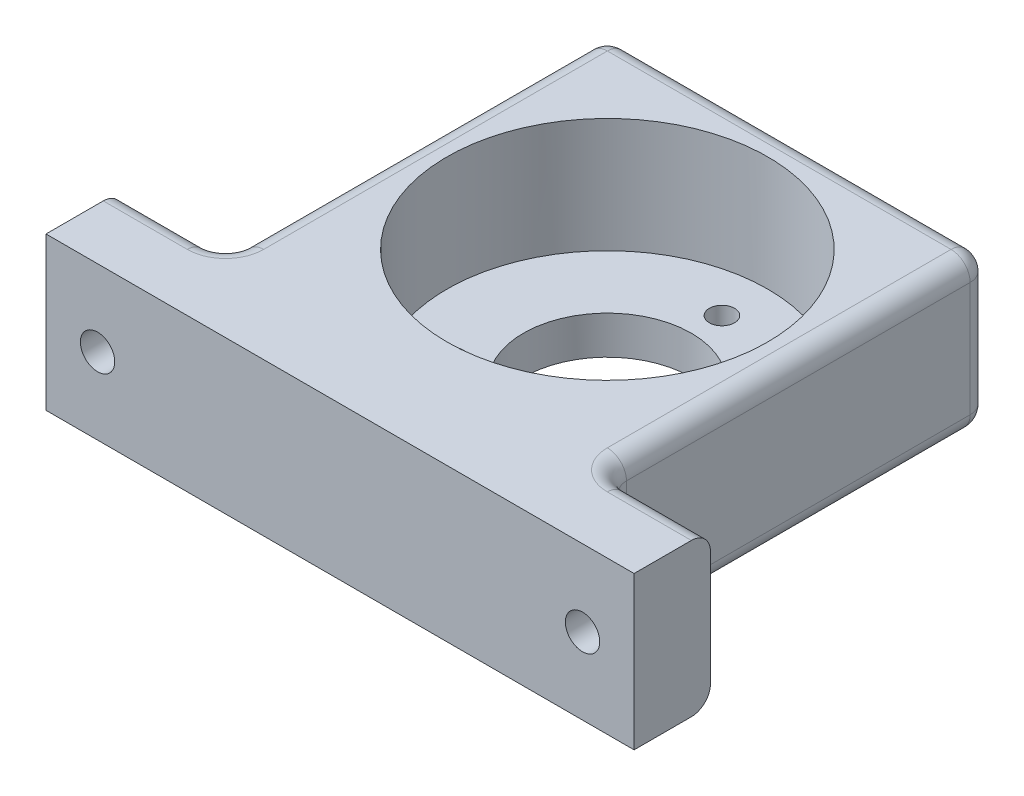
ISO-10303-21;
HEADER;
FILE_DESCRIPTION(('STEP AP214'),'2;1');
FILE_NAME('part.step','',(''),(''),'','','');
FILE_SCHEMA(('AUTOMOTIVE_DESIGN { 1 0 10303 214 1 1 1 1 }'));
ENDSEC;
DATA;
#1=APPLICATION_CONTEXT('core data for automotive mechanical design processes');
#2=APPLICATION_PROTOCOL_DEFINITION('international standard','automotive_design',2000,#1);
#3=PRODUCT_CONTEXT('',#1,'mechanical');
#4=PRODUCT('Part','Part','',(#3));
#5=PRODUCT_RELATED_PRODUCT_CATEGORY('part','',(#4));
#6=PRODUCT_DEFINITION_FORMATION('','',#4);
#7=PRODUCT_DEFINITION_CONTEXT('part definition',#1,'design');
#8=PRODUCT_DEFINITION('design','',#6,#7);
#9=PRODUCT_DEFINITION_SHAPE('','',#8);
#10=(LENGTH_UNIT() NAMED_UNIT(*) SI_UNIT(.MILLI.,.METRE.));
#11=(NAMED_UNIT(*) PLANE_ANGLE_UNIT() SI_UNIT($,.RADIAN.));
#12=(NAMED_UNIT(*) SI_UNIT($,.STERADIAN.) SOLID_ANGLE_UNIT());
#13=UNCERTAINTY_MEASURE_WITH_UNIT(LENGTH_MEASURE(1.E-05),#10,'distance_accuracy_value','');
#14=(GEOMETRIC_REPRESENTATION_CONTEXT(3) GLOBAL_UNCERTAINTY_ASSIGNED_CONTEXT((#13)) GLOBAL_UNIT_ASSIGNED_CONTEXT((#10,
#11,#12)) REPRESENTATION_CONTEXT('',''));
#15=CARTESIAN_POINT('',(0.,0.,0.));
#16=DIRECTION('',(0.,0.,1.));
#17=DIRECTION('',(1.,0.,0.));
#18=AXIS2_PLACEMENT_3D('',#15,#16,#17);
#19=CARTESIAN_POINT('',(38.5,20.,25.));
#20=DIRECTION('',(0.,0.,1.));
#21=DIRECTION('',(1.,0.,0.));
#22=AXIS2_PLACEMENT_3D('',#19,#20,#21);
#23=PLANE('',#22);
#24=DIRECTION('',(0.,-1.,0.));
#25=VECTOR('',#24,1.);
#26=CARTESIAN_POINT('',(27.5,20.,25.));
#27=LINE('',#26,#25);
#28=CARTESIAN_POINT('',(27.5,2.5,25.));
#29=VERTEX_POINT('',#28);
#30=CARTESIAN_POINT('',(27.5,17.5,25.));
#31=VERTEX_POINT('',#30);
#32=EDGE_CURVE('E240',#29,#31,#27,.F.);
#33=ORIENTED_EDGE('',*,*,#32,.T.);
#34=DIRECTION('',(-1.,0.,0.));
#35=VECTOR('',#34,1.);
#36=CARTESIAN_POINT('',(38.5,17.5,25.));
#37=LINE('',#36,#35);
#38=CARTESIAN_POINT('',(38.5,17.5,25.));
#39=VERTEX_POINT('',#38);
#40=EDGE_CURVE('E244',#31,#39,#37,.F.);
#41=ORIENTED_EDGE('',*,*,#40,.T.);
#42=DIRECTION('',(0.,-1.,0.));
#43=VECTOR('',#42,1.);
#44=CARTESIAN_POINT('',(38.5,20.,25.));
#45=LINE('',#44,#43);
#46=CARTESIAN_POINT('',(38.5,2.5,25.));
#47=VERTEX_POINT('',#46);
#48=EDGE_CURVE('E205',#39,#47,#45,.T.);
#49=ORIENTED_EDGE('',*,*,#48,.T.);
#50=DIRECTION('',(-1.,0.,0.));
#51=VECTOR('',#50,1.);
#52=CARTESIAN_POINT('',(25.,2.5,25.));
#53=LINE('',#52,#51);
#54=EDGE_CURVE('E242',#47,#29,#53,.T.);
#55=ORIENTED_EDGE('',*,*,#54,.T.);
#56=EDGE_LOOP('',(#33,#41,#49,#55));
#57=FACE_BOUND('',#56,.T.);
#58=CARTESIAN_POINT('',(31.75,10.,25.));
#59=DIRECTION('',(0.,0.,-1.));
#60=DIRECTION('',(-1.,0.,0.));
#61=AXIS2_PLACEMENT_3D('',#58,#59,#60);
#62=CIRCLE('',#61,4.);
#63=CARTESIAN_POINT('',(27.75,10.,25.));
#64=VERTEX_POINT('',#63);
#65=EDGE_CURVE('E381',#64,#64,#62,.T.);
#66=ORIENTED_EDGE('',*,*,#65,.F.);
#67=EDGE_LOOP('',(#66));
#68=FACE_BOUND('',#67,.T.);
#69=ADVANCED_FACE('F37',(#57,#68),#23,.F.);
#70=CARTESIAN_POINT('',(-25.,20.,25.));
#71=DIRECTION('',(0.,0.,1.));
#72=DIRECTION('',(1.,0.,0.));
#73=AXIS2_PLACEMENT_3D('',#70,#71,#72);
#74=PLANE('',#73);
#75=DIRECTION('',(0.,-1.,0.));
#76=VECTOR('',#75,1.);
#77=CARTESIAN_POINT('',(-38.5,20.,25.));
#78=LINE('',#77,#76);
#79=CARTESIAN_POINT('',(-38.5,17.5,25.));
#80=VERTEX_POINT('',#79);
#81=CARTESIAN_POINT('',(-38.5,2.5,25.));
#82=VERTEX_POINT('',#81);
#83=EDGE_CURVE('E197',#80,#82,#78,.T.);
#84=ORIENTED_EDGE('',*,*,#83,.F.);
#85=DIRECTION('',(-1.,0.,0.));
#86=VECTOR('',#85,1.);
#87=CARTESIAN_POINT('',(-25.,17.5,25.));
#88=LINE('',#87,#86);
#89=CARTESIAN_POINT('',(-27.5,17.5,25.));
#90=VERTEX_POINT('',#89);
#91=EDGE_CURVE('E274',#80,#90,#88,.F.);
#92=ORIENTED_EDGE('',*,*,#91,.T.);
#93=DIRECTION('',(0.,-1.,0.));
#94=VECTOR('',#93,1.);
#95=CARTESIAN_POINT('',(-27.5,0.,25.));
#96=LINE('',#95,#94);
#97=CARTESIAN_POINT('',(-27.5,2.5,25.));
#98=VERTEX_POINT('',#97);
#99=EDGE_CURVE('E270',#90,#98,#96,.T.);
#100=ORIENTED_EDGE('',*,*,#99,.T.);
#101=DIRECTION('',(-1.,0.,0.));
#102=VECTOR('',#101,1.);
#103=CARTESIAN_POINT('',(-38.5,2.5,25.));
#104=LINE('',#103,#102);
#105=EDGE_CURVE('E272',#98,#82,#104,.T.);
#106=ORIENTED_EDGE('',*,*,#105,.T.);
#107=EDGE_LOOP('',(#84,#92,#100,#106));
#108=FACE_BOUND('',#107,.T.);
#109=CARTESIAN_POINT('',(-31.75,10.,25.));
#110=DIRECTION('',(0.,0.,-1.));
#111=DIRECTION('',(-1.,0.,0.));
#112=AXIS2_PLACEMENT_3D('',#109,#110,#111);
#113=CIRCLE('',#112,4.);
#114=CARTESIAN_POINT('',(-35.75,10.,25.));
#115=VERTEX_POINT('',#114);
#116=EDGE_CURVE('E394',#115,#115,#113,.T.);
#117=ORIENTED_EDGE('',*,*,#116,.F.);
#118=EDGE_LOOP('',(#117));
#119=FACE_BOUND('',#118,.T.);
#120=ADVANCED_FACE('F434',(#108,#119),#74,.F.);
#121=CARTESIAN_POINT('',(0.,20.,0.));
#122=DIRECTION('',(0.,-1.,0.));
#123=DIRECTION('',(0.,0.,-1.));
#124=AXIS2_PLACEMENT_3D('',#121,#122,#123);
#125=PLANE('',#124);
#126=DIRECTION('',(0.,0.,-1.));
#127=VECTOR('',#126,1.);
#128=CARTESIAN_POINT('',(38.5,20.,35.));
#129=LINE('',#128,#127);
#130=CARTESIAN_POINT('',(38.5,20.,35.));
#131=VERTEX_POINT('',#130);
#132=CARTESIAN_POINT('',(38.5,20.,27.5));
#133=VERTEX_POINT('',#132);
#134=EDGE_CURVE('E203',#131,#133,#129,.T.);
#135=ORIENTED_EDGE('',*,*,#134,.T.);
#136=DIRECTION('',(-1.,0.,0.));
#137=VECTOR('',#136,1.);
#138=CARTESIAN_POINT('',(0.,20.,27.5));
#139=LINE('',#138,#137);
#140=CARTESIAN_POINT('',(27.5,20.,27.5));
#141=VERTEX_POINT('',#140);
#142=EDGE_CURVE('E237',#133,#141,#139,.T.);
#143=ORIENTED_EDGE('',*,*,#142,.T.);
#144=CARTESIAN_POINT('',(27.5,20.,22.5));
#145=DIRECTION('',(0.,-1.,0.));
#146=DIRECTION('',(0.,0.,-1.));
#147=AXIS2_PLACEMENT_3D('',#144,#145,#146);
#148=CIRCLE('',#147,5.);
#149=CARTESIAN_POINT('',(22.5,20.,22.5));
#150=VERTEX_POINT('',#149);
#151=EDGE_CURVE('E234',#150,#141,#148,.F.);
#152=ORIENTED_EDGE('',*,*,#151,.F.);
#153=DIRECTION('',(0.,0.,-1.));
#154=VECTOR('',#153,1.);
#155=CARTESIAN_POINT('',(22.5,20.,0.));
#156=LINE('',#155,#154);
#157=CARTESIAN_POINT('',(22.5,20.,-22.5));
#158=VERTEX_POINT('',#157);
#159=EDGE_CURVE('E232',#150,#158,#156,.T.);
#160=ORIENTED_EDGE('',*,*,#159,.T.);
#161=DIRECTION('',(-1.,0.,0.));
#162=VECTOR('',#161,1.);
#163=CARTESIAN_POINT('',(0.,20.,-22.5));
#164=LINE('',#163,#162);
#165=CARTESIAN_POINT('',(-22.5,20.,-22.5));
#166=VERTEX_POINT('',#165);
#167=EDGE_CURVE('E229',#158,#166,#164,.T.);
#168=ORIENTED_EDGE('',*,*,#167,.T.);
#169=DIRECTION('',(0.,0.,1.));
#170=VECTOR('',#169,1.);
#171=CARTESIAN_POINT('',(-22.5,20.,0.));
#172=LINE('',#171,#170);
#173=CARTESIAN_POINT('',(-22.5,20.,22.5));
#174=VERTEX_POINT('',#173);
#175=EDGE_CURVE('E227',#166,#174,#172,.T.);
#176=ORIENTED_EDGE('',*,*,#175,.T.);
#177=CARTESIAN_POINT('',(-27.5,20.,22.5));
#178=DIRECTION('',(0.,-1.,0.));
#179=DIRECTION('',(0.,0.,-1.));
#180=AXIS2_PLACEMENT_3D('',#177,#178,#179);
#181=CIRCLE('',#180,5.);
#182=CARTESIAN_POINT('',(-27.5,20.,27.5));
#183=VERTEX_POINT('',#182);
#184=EDGE_CURVE('E220',#183,#174,#181,.F.);
#185=ORIENTED_EDGE('',*,*,#184,.F.);
#186=DIRECTION('',(-1.,0.,0.));
#187=VECTOR('',#186,1.);
#188=CARTESIAN_POINT('',(0.,20.,27.5));
#189=LINE('',#188,#187);
#190=CARTESIAN_POINT('',(-38.5,20.,27.5));
#191=VERTEX_POINT('',#190);
#192=EDGE_CURVE('E185',#183,#191,#189,.T.);
#193=ORIENTED_EDGE('',*,*,#192,.T.);
#194=DIRECTION('',(0.,0.,1.));
#195=VECTOR('',#194,1.);
#196=CARTESIAN_POINT('',(-38.5,20.,25.));
#197=LINE('',#196,#195);
#198=CARTESIAN_POINT('',(-38.5,20.,35.));
#199=VERTEX_POINT('',#198);
#200=EDGE_CURVE('E176',#191,#199,#197,.T.);
#201=ORIENTED_EDGE('',*,*,#200,.T.);
#202=DIRECTION('',(1.,0.,0.));
#203=VECTOR('',#202,1.);
#204=CARTESIAN_POINT('',(-38.5,20.,35.));
#205=LINE('',#204,#203);
#206=EDGE_CURVE('E182',#199,#131,#205,.T.);
#207=ORIENTED_EDGE('',*,*,#206,.T.);
#208=EDGE_LOOP('',(#135,#143,#152,#160,#168,#176,#185,#193,#201,#207));
#209=FACE_BOUND('',#208,.T.);
#210=CARTESIAN_POINT('',(0.,20.,0.));
#211=DIRECTION('',(0.,1.,0.));
#212=DIRECTION('',(0.,0.,1.));
#213=AXIS2_PLACEMENT_3D('',#210,#211,#212);
#214=CIRCLE('',#213,21.);
#215=CARTESIAN_POINT('',(0.,20.,21.));
#216=VERTEX_POINT('',#215);
#217=EDGE_CURVE('E406',#216,#216,#214,.T.);
#218=ORIENTED_EDGE('',*,*,#217,.F.);
#219=EDGE_LOOP('',(#218));
#220=FACE_BOUND('',#219,.T.);
#221=ADVANCED_FACE('F179',(#209,#220),#125,.F.);
#222=CARTESIAN_POINT('',(0.,0.,0.));
#223=DIRECTION('',(0.,-1.,0.));
#224=DIRECTION('',(0.,0.,-1.));
#225=AXIS2_PLACEMENT_3D('',#222,#223,#224);
#226=PLANE('',#225);
#227=CARTESIAN_POINT('',(12.9903810567666,0.,7.49999999999988));
#228=DIRECTION('',(0.,-1.,0.));
#229=DIRECTION('',(0.,0.,-1.));
#230=AXIS2_PLACEMENT_3D('',#227,#228,#229);
#231=CIRCLE('',#230,1.65);
#232=CARTESIAN_POINT('',(12.9903810567666,0.,5.84999999999988));
#233=VERTEX_POINT('',#232);
#234=EDGE_CURVE('E635',#233,#233,#231,.T.);
#235=ORIENTED_EDGE('',*,*,#234,.F.);
#236=EDGE_LOOP('',(#235));
#237=FACE_BOUND('',#236,.T.);
#238=CARTESIAN_POINT('',(-12.9903810567665,0.,7.50000000000006));
#239=DIRECTION('',(0.,-1.,0.));
#240=DIRECTION('',(0.,0.,-1.));
#241=AXIS2_PLACEMENT_3D('',#238,#239,#240);
#242=CIRCLE('',#241,1.65);
#243=CARTESIAN_POINT('',(-12.9903810567665,0.,5.85000000000006));
#244=VERTEX_POINT('',#243);
#245=EDGE_CURVE('E375',#244,#244,#242,.T.);
#246=ORIENTED_EDGE('',*,*,#245,.F.);
#247=EDGE_LOOP('',(#246));
#248=FACE_BOUND('',#247,.T.);
#249=CARTESIAN_POINT('',(0.,0.,-15.));
#250=DIRECTION('',(0.,-1.,0.));
#251=DIRECTION('',(0.,0.,-1.));
#252=AXIS2_PLACEMENT_3D('',#249,#250,#251);
#253=CIRCLE('',#252,1.65);
#254=CARTESIAN_POINT('',(0.,0.,-16.65));
#255=VERTEX_POINT('',#254);
#256=EDGE_CURVE('E366',#255,#255,#253,.T.);
#257=ORIENTED_EDGE('',*,*,#256,.F.);
#258=EDGE_LOOP('',(#257));
#259=FACE_BOUND('',#258,.T.);
#260=CARTESIAN_POINT('',(27.5,0.,22.5));
#261=DIRECTION('',(0.,-1.,0.));
#262=DIRECTION('',(0.,0.,-1.));
#263=AXIS2_PLACEMENT_3D('',#260,#261,#262);
#264=CIRCLE('',#263,5.);
#265=CARTESIAN_POINT('',(27.5,0.,27.5));
#266=VERTEX_POINT('',#265);
#267=CARTESIAN_POINT('',(22.5,0.,22.5));
#268=VERTEX_POINT('',#267);
#269=EDGE_CURVE('E261',#266,#268,#264,.T.);
#270=ORIENTED_EDGE('',*,*,#269,.F.);
#271=DIRECTION('',(-1.,0.,0.));
#272=VECTOR('',#271,1.);
#273=CARTESIAN_POINT('',(38.5,0.,27.5));
#274=LINE('',#273,#272);
#275=CARTESIAN_POINT('',(38.5,0.,27.5));
#276=VERTEX_POINT('',#275);
#277=EDGE_CURVE('E264',#266,#276,#274,.F.);
#278=ORIENTED_EDGE('',*,*,#277,.T.);
#279=DIRECTION('',(0.,0.,-1.));
#280=VECTOR('',#279,1.);
#281=CARTESIAN_POINT('',(38.5,0.,35.));
#282=LINE('',#281,#280);
#283=CARTESIAN_POINT('',(38.5,0.,35.));
#284=VERTEX_POINT('',#283);
#285=EDGE_CURVE('E188',#284,#276,#282,.T.);
#286=ORIENTED_EDGE('',*,*,#285,.F.);
#287=DIRECTION('',(1.,0.,0.));
#288=VECTOR('',#287,1.);
#289=CARTESIAN_POINT('',(-38.5,0.,35.));
#290=LINE('',#289,#288);
#291=CARTESIAN_POINT('',(-38.5,0.,35.));
#292=VERTEX_POINT('',#291);
#293=EDGE_CURVE('E210',#292,#284,#290,.T.);
#294=ORIENTED_EDGE('',*,*,#293,.F.);
#295=DIRECTION('',(0.,0.,1.));
#296=VECTOR('',#295,1.);
#297=CARTESIAN_POINT('',(-38.5,0.,25.));
#298=LINE('',#297,#296);
#299=CARTESIAN_POINT('',(-38.5,0.,27.5));
#300=VERTEX_POINT('',#299);
#301=EDGE_CURVE('E194',#300,#292,#298,.T.);
#302=ORIENTED_EDGE('',*,*,#301,.F.);
#303=DIRECTION('',(-1.,0.,0.));
#304=VECTOR('',#303,1.);
#305=CARTESIAN_POINT('',(-25.,0.,27.5));
#306=LINE('',#305,#304);
#307=CARTESIAN_POINT('',(-27.5,0.,27.5));
#308=VERTEX_POINT('',#307);
#309=EDGE_CURVE('E257',#300,#308,#306,.F.);
#310=ORIENTED_EDGE('',*,*,#309,.T.);
#311=CARTESIAN_POINT('',(-27.5,0.,22.5));
#312=DIRECTION('',(0.,-1.,0.));
#313=DIRECTION('',(0.,0.,-1.));
#314=AXIS2_PLACEMENT_3D('',#311,#312,#313);
#315=CIRCLE('',#314,5.);
#316=CARTESIAN_POINT('',(-22.5,0.,22.5));
#317=VERTEX_POINT('',#316);
#318=EDGE_CURVE('E254',#317,#308,#315,.T.);
#319=ORIENTED_EDGE('',*,*,#318,.F.);
#320=DIRECTION('',(0.,0.,1.));
#321=VECTOR('',#320,1.);
#322=CARTESIAN_POINT('',(-22.5,0.,-25.));
#323=LINE('',#322,#321);
#324=CARTESIAN_POINT('',(-22.5,0.,-22.5));
#325=VERTEX_POINT('',#324);
#326=EDGE_CURVE('E250',#317,#325,#323,.F.);
#327=ORIENTED_EDGE('',*,*,#326,.T.);
#328=DIRECTION('',(-1.,0.,0.));
#329=VECTOR('',#328,1.);
#330=CARTESIAN_POINT('',(25.,0.,-22.5));
#331=LINE('',#330,#329);
#332=CARTESIAN_POINT('',(22.5,0.,-22.5));
#333=VERTEX_POINT('',#332);
#334=EDGE_CURVE('E252',#325,#333,#331,.F.);
#335=ORIENTED_EDGE('',*,*,#334,.T.);
#336=DIRECTION('',(0.,0.,-1.));
#337=VECTOR('',#336,1.);
#338=CARTESIAN_POINT('',(22.5,0.,25.));
#339=LINE('',#338,#337);
#340=EDGE_CURVE('E259',#333,#268,#339,.F.);
#341=ORIENTED_EDGE('',*,*,#340,.T.);
#342=EDGE_LOOP('',(#270,#278,#286,#294,#302,#310,#319,#327,#335,#341));
#343=FACE_BOUND('',#342,.T.);
#344=CARTESIAN_POINT('',(0.,0.,0.));
#345=DIRECTION('',(0.,1.,0.));
#346=DIRECTION('',(0.,0.,1.));
#347=AXIS2_PLACEMENT_3D('',#344,#345,#346);
#348=CIRCLE('',#347,11.);
#349=CARTESIAN_POINT('',(0.,0.,11.));
#350=VERTEX_POINT('',#349);
#351=EDGE_CURVE('E211',#350,#350,#348,.T.);
#352=ORIENTED_EDGE('',*,*,#351,.T.);
#353=EDGE_LOOP('',(#352));
#354=FACE_BOUND('',#353,.T.);
#355=ADVANCED_FACE('F413',(#237,#248,#259,#343,#354),#226,.T.);
#356=CARTESIAN_POINT('',(-25.,20.,-25.));
#357=DIRECTION('',(0.,0.,1.));
#358=DIRECTION('',(1.,0.,0.));
#359=AXIS2_PLACEMENT_3D('',#356,#357,#358);
#360=PLANE('',#359);
#361=DIRECTION('',(-1.,0.,0.));
#362=VECTOR('',#361,1.);
#363=CARTESIAN_POINT('',(-25.,17.5,-25.));
#364=LINE('',#363,#362);
#365=CARTESIAN_POINT('',(-22.5,17.5,-25.));
#366=VERTEX_POINT('',#365);
#367=CARTESIAN_POINT('',(22.5,17.5,-25.));
#368=VERTEX_POINT('',#367);
#369=EDGE_CURVE('E46',#366,#368,#364,.F.);
#370=ORIENTED_EDGE('',*,*,#369,.T.);
#371=DIRECTION('',(0.,-1.,0.));
#372=VECTOR('',#371,1.);
#373=CARTESIAN_POINT('',(22.5,20.,-25.));
#374=LINE('',#373,#372);
#375=CARTESIAN_POINT('',(22.5,2.5,-25.));
#376=VERTEX_POINT('',#375);
#377=EDGE_CURVE('E12',#368,#376,#374,.T.);
#378=ORIENTED_EDGE('',*,*,#377,.T.);
#379=DIRECTION('',(-1.,0.,0.));
#380=VECTOR('',#379,1.);
#381=CARTESIAN_POINT('',(-25.,2.5,-25.));
#382=LINE('',#381,#380);
#383=CARTESIAN_POINT('',(-22.5,2.5,-25.));
#384=VERTEX_POINT('',#383);
#385=EDGE_CURVE('E296',#376,#384,#382,.T.);
#386=ORIENTED_EDGE('',*,*,#385,.T.);
#387=DIRECTION('',(0.,-1.,0.));
#388=VECTOR('',#387,1.);
#389=CARTESIAN_POINT('',(-22.5,20.,-25.));
#390=LINE('',#389,#388);
#391=EDGE_CURVE('E294',#384,#366,#390,.F.);
#392=ORIENTED_EDGE('',*,*,#391,.T.);
#393=EDGE_LOOP('',(#370,#378,#386,#392));
#394=FACE_BOUND('',#393,.T.);
#395=ADVANCED_FACE('F456',(#394),#360,.F.);
#396=CARTESIAN_POINT('',(-25.,20.,25.));
#397=DIRECTION('',(1.,0.,0.));
#398=DIRECTION('',(0.,0.,-1.));
#399=AXIS2_PLACEMENT_3D('',#396,#397,#398);
#400=PLANE('',#399);
#401=DIRECTION('',(0.,0.,1.));
#402=VECTOR('',#401,1.);
#403=CARTESIAN_POINT('',(-25.,2.5,25.));
#404=LINE('',#403,#402);
#405=CARTESIAN_POINT('',(-25.,2.5,-22.5));
#406=VERTEX_POINT('',#405);
#407=CARTESIAN_POINT('',(-25.,2.5,22.5));
#408=VERTEX_POINT('',#407);
#409=EDGE_CURVE('E289',#406,#408,#404,.T.);
#410=ORIENTED_EDGE('',*,*,#409,.T.);
#411=DIRECTION('',(0.,-1.,0.));
#412=VECTOR('',#411,1.);
#413=CARTESIAN_POINT('',(-25.,20.,22.5));
#414=LINE('',#413,#412);
#415=CARTESIAN_POINT('',(-25.,17.5,22.5));
#416=VERTEX_POINT('',#415);
#417=EDGE_CURVE('E291',#408,#416,#414,.F.);
#418=ORIENTED_EDGE('',*,*,#417,.T.);
#419=DIRECTION('',(0.,0.,1.));
#420=VECTOR('',#419,1.);
#421=CARTESIAN_POINT('',(-25.,17.5,25.));
#422=LINE('',#421,#420);
#423=CARTESIAN_POINT('',(-25.,17.5,-22.5));
#424=VERTEX_POINT('',#423);
#425=EDGE_CURVE('E287',#416,#424,#422,.F.);
#426=ORIENTED_EDGE('',*,*,#425,.T.);
#427=DIRECTION('',(0.,-1.,0.));
#428=VECTOR('',#427,1.);
#429=CARTESIAN_POINT('',(-25.,20.,-22.5));
#430=LINE('',#429,#428);
#431=EDGE_CURVE('E285',#424,#406,#430,.T.);
#432=ORIENTED_EDGE('',*,*,#431,.T.);
#433=EDGE_LOOP('',(#410,#418,#426,#432));
#434=FACE_BOUND('',#433,.T.);
#435=ADVANCED_FACE('F452',(#434),#400,.F.);
#436=CARTESIAN_POINT('',(-38.5,20.,25.));
#437=DIRECTION('',(1.,0.,0.));
#438=DIRECTION('',(0.,0.,-1.));
#439=AXIS2_PLACEMENT_3D('',#436,#437,#438);
#440=PLANE('',#439);
#441=ORIENTED_EDGE('',*,*,#200,.F.);
#442=CARTESIAN_POINT('',(-38.5,17.5,27.5));
#443=DIRECTION('',(1.,0.,0.));
#444=DIRECTION('',(0.,0.,-1.));
#445=AXIS2_PLACEMENT_3D('',#442,#443,#444);
#446=CIRCLE('',#445,2.5);
#447=EDGE_CURVE('E268',#191,#80,#446,.F.);
#448=ORIENTED_EDGE('',*,*,#447,.T.);
#449=ORIENTED_EDGE('',*,*,#83,.T.);
#450=CARTESIAN_POINT('',(-38.5,2.5,27.5));
#451=DIRECTION('',(1.,0.,0.));
#452=DIRECTION('',(0.,0.,-1.));
#453=AXIS2_PLACEMENT_3D('',#450,#451,#452);
#454=CIRCLE('',#453,2.5);
#455=EDGE_CURVE('E266',#82,#300,#454,.F.);
#456=ORIENTED_EDGE('',*,*,#455,.T.);
#457=ORIENTED_EDGE('',*,*,#301,.T.);
#458=DIRECTION('',(0.,-1.,0.));
#459=VECTOR('',#458,1.);
#460=CARTESIAN_POINT('',(-38.5,20.,35.));
#461=LINE('',#460,#459);
#462=EDGE_CURVE('E191',#199,#292,#461,.T.);
#463=ORIENTED_EDGE('',*,*,#462,.F.);
#464=EDGE_LOOP('',(#441,#448,#449,#456,#457,#463));
#465=FACE_BOUND('',#464,.T.);
#466=ADVANCED_FACE('F192',(#465),#440,.F.);
#467=CARTESIAN_POINT('',(-38.5,20.,35.));
#468=DIRECTION('',(0.,0.,-1.));
#469=DIRECTION('',(-1.,0.,0.));
#470=AXIS2_PLACEMENT_3D('',#467,#468,#469);
#471=PLANE('',#470);
#472=CARTESIAN_POINT('',(31.75,10.,35.));
#473=DIRECTION('',(0.,0.,-1.));
#474=DIRECTION('',(-1.,0.,0.));
#475=AXIS2_PLACEMENT_3D('',#472,#473,#474);
#476=CIRCLE('',#475,2.25);
#477=CARTESIAN_POINT('',(29.5,10.,35.));
#478=VERTEX_POINT('',#477);
#479=EDGE_CURVE('E391',#478,#478,#476,.T.);
#480=ORIENTED_EDGE('',*,*,#479,.T.);
#481=EDGE_LOOP('',(#480));
#482=FACE_BOUND('',#481,.T.);
#483=CARTESIAN_POINT('',(-31.75,10.,35.));
#484=DIRECTION('',(0.,0.,-1.));
#485=DIRECTION('',(-1.,0.,0.));
#486=AXIS2_PLACEMENT_3D('',#483,#484,#485);
#487=CIRCLE('',#486,2.25);
#488=CARTESIAN_POINT('',(-34.,10.,35.));
#489=VERTEX_POINT('',#488);
#490=EDGE_CURVE('E403',#489,#489,#487,.T.);
#491=ORIENTED_EDGE('',*,*,#490,.T.);
#492=EDGE_LOOP('',(#491));
#493=FACE_BOUND('',#492,.T.);
#494=ORIENTED_EDGE('',*,*,#293,.T.);
#495=DIRECTION('',(0.,-1.,0.));
#496=VECTOR('',#495,1.);
#497=CARTESIAN_POINT('',(38.5,20.,35.));
#498=LINE('',#497,#496);
#499=EDGE_CURVE('E198',#131,#284,#498,.T.);
#500=ORIENTED_EDGE('',*,*,#499,.F.);
#501=ORIENTED_EDGE('',*,*,#206,.F.);
#502=ORIENTED_EDGE('',*,*,#462,.T.);
#503=EDGE_LOOP('',(#494,#500,#501,#502));
#504=FACE_BOUND('',#503,.T.);
#505=ADVANCED_FACE('F200',(#482,#493,#504),#471,.F.);
#506=CARTESIAN_POINT('',(38.5,20.,35.));
#507=DIRECTION('',(-1.,0.,0.));
#508=DIRECTION('',(0.,0.,1.));
#509=AXIS2_PLACEMENT_3D('',#506,#507,#508);
#510=PLANE('',#509);
#511=ORIENTED_EDGE('',*,*,#48,.F.);
#512=CARTESIAN_POINT('',(38.5,17.5,27.5));
#513=DIRECTION('',(-1.,0.,0.));
#514=DIRECTION('',(0.,0.,1.));
#515=AXIS2_PLACEMENT_3D('',#512,#513,#514);
#516=CIRCLE('',#515,2.5);
#517=EDGE_CURVE('E248',#39,#133,#516,.F.);
#518=ORIENTED_EDGE('',*,*,#517,.T.);
#519=ORIENTED_EDGE('',*,*,#134,.F.);
#520=ORIENTED_EDGE('',*,*,#499,.T.);
#521=ORIENTED_EDGE('',*,*,#285,.T.);
#522=CARTESIAN_POINT('',(38.5,2.5,27.5));
#523=DIRECTION('',(-1.,0.,0.));
#524=DIRECTION('',(0.,0.,1.));
#525=AXIS2_PLACEMENT_3D('',#522,#523,#524);
#526=CIRCLE('',#525,2.5);
#527=EDGE_CURVE('E246',#276,#47,#526,.F.);
#528=ORIENTED_EDGE('',*,*,#527,.T.);
#529=EDGE_LOOP('',(#511,#518,#519,#520,#521,#528));
#530=FACE_BOUND('',#529,.T.);
#531=ADVANCED_FACE('F428',(#530),#510,.F.);
#532=CARTESIAN_POINT('',(25.,20.,-25.));
#533=DIRECTION('',(-1.,0.,0.));
#534=DIRECTION('',(0.,0.,1.));
#535=AXIS2_PLACEMENT_3D('',#532,#533,#534);
#536=PLANE('',#535);
#537=DIRECTION('',(0.,0.,-1.));
#538=VECTOR('',#537,1.);
#539=CARTESIAN_POINT('',(25.,17.5,-25.));
#540=LINE('',#539,#538);
#541=CARTESIAN_POINT('',(25.,17.5,-22.5));
#542=VERTEX_POINT('',#541);
#543=CARTESIAN_POINT('',(25.,17.5,22.5));
#544=VERTEX_POINT('',#543);
#545=EDGE_CURVE('E280',#542,#544,#540,.F.);
#546=ORIENTED_EDGE('',*,*,#545,.T.);
#547=DIRECTION('',(0.,-1.,0.));
#548=VECTOR('',#547,1.);
#549=CARTESIAN_POINT('',(25.,0.,22.5));
#550=LINE('',#549,#548);
#551=CARTESIAN_POINT('',(25.,2.5,22.5));
#552=VERTEX_POINT('',#551);
#553=EDGE_CURVE('E282',#544,#552,#550,.T.);
#554=ORIENTED_EDGE('',*,*,#553,.T.);
#555=DIRECTION('',(0.,0.,-1.));
#556=VECTOR('',#555,1.);
#557=CARTESIAN_POINT('',(25.,2.5,-25.));
#558=LINE('',#557,#556);
#559=CARTESIAN_POINT('',(25.,2.5,-22.5));
#560=VERTEX_POINT('',#559);
#561=EDGE_CURVE('E278',#552,#560,#558,.T.);
#562=ORIENTED_EDGE('',*,*,#561,.T.);
#563=DIRECTION('',(0.,-1.,0.));
#564=VECTOR('',#563,1.);
#565=CARTESIAN_POINT('',(25.,20.,-22.5));
#566=LINE('',#565,#564);
#567=EDGE_CURVE('E276',#560,#542,#566,.F.);
#568=ORIENTED_EDGE('',*,*,#567,.T.);
#569=EDGE_LOOP('',(#546,#554,#562,#568));
#570=FACE_BOUND('',#569,.T.);
#571=ADVANCED_FACE('F418',(#570),#536,.F.);
#572=CARTESIAN_POINT('',(0.,20.,0.));
#573=DIRECTION('',(0.,-1.,0.));
#574=DIRECTION('',(0.,0.,-1.));
#575=AXIS2_PLACEMENT_3D('',#572,#573,#574);
#576=CYLINDRICAL_SURFACE('',#575,11.);
#577=CARTESIAN_POINT('',(0.,5.,0.));
#578=DIRECTION('',(0.,-1.,0.));
#579=DIRECTION('',(0.,0.,-1.));
#580=AXIS2_PLACEMENT_3D('',#577,#578,#579);
#581=CIRCLE('',#580,11.);
#582=CARTESIAN_POINT('',(0.,5.,-11.));
#583=VERTEX_POINT('',#582);
#584=EDGE_CURVE('E221',#583,#583,#581,.T.);
#585=ORIENTED_EDGE('',*,*,#584,.F.);
#586=EDGE_LOOP('',(#585));
#587=FACE_BOUND('',#586,.T.);
#588=ORIENTED_EDGE('',*,*,#351,.F.);
#589=EDGE_LOOP('',(#588));
#590=FACE_BOUND('',#589,.T.);
#591=ADVANCED_FACE('F415',(#587,#590),#576,.F.);
#592=CARTESIAN_POINT('',(0.,5.,0.));
#593=DIRECTION('',(0.,-1.,0.));
#594=DIRECTION('',(0.,0.,-1.));
#595=AXIS2_PLACEMENT_3D('',#592,#593,#594);
#596=PLANE('',#595);
#597=CARTESIAN_POINT('',(12.9903810567666,5.,7.49999999999988));
#598=DIRECTION('',(0.,-1.,0.));
#599=DIRECTION('',(0.,0.,-1.));
#600=AXIS2_PLACEMENT_3D('',#597,#598,#599);
#601=CIRCLE('',#600,1.65);
#602=CARTESIAN_POINT('',(12.9903810567666,5.,5.84999999999988));
#603=VERTEX_POINT('',#602);
#604=EDGE_CURVE('E385',#603,#603,#601,.F.);
#605=ORIENTED_EDGE('',*,*,#604,.F.);
#606=EDGE_LOOP('',(#605));
#607=FACE_BOUND('',#606,.T.);
#608=CARTESIAN_POINT('',(-12.9903810567665,5.,7.50000000000006));
#609=DIRECTION('',(0.,-1.,0.));
#610=DIRECTION('',(0.,0.,-1.));
#611=AXIS2_PLACEMENT_3D('',#608,#609,#610);
#612=CIRCLE('',#611,1.65);
#613=CARTESIAN_POINT('',(-12.9903810567665,5.,5.85000000000006));
#614=VERTEX_POINT('',#613);
#615=EDGE_CURVE('E378',#614,#614,#612,.F.);
#616=ORIENTED_EDGE('',*,*,#615,.F.);
#617=EDGE_LOOP('',(#616));
#618=FACE_BOUND('',#617,.T.);
#619=CARTESIAN_POINT('',(0.,5.,-15.));
#620=DIRECTION('',(0.,-1.,0.));
#621=DIRECTION('',(0.,0.,-1.));
#622=AXIS2_PLACEMENT_3D('',#619,#620,#621);
#623=CIRCLE('',#622,1.65);
#624=CARTESIAN_POINT('',(0.,5.,-16.65));
#625=VERTEX_POINT('',#624);
#626=EDGE_CURVE('E370',#625,#625,#623,.F.);
#627=ORIENTED_EDGE('',*,*,#626,.F.);
#628=EDGE_LOOP('',(#627));
#629=FACE_BOUND('',#628,.T.);
#630=ORIENTED_EDGE('',*,*,#584,.T.);
#631=EDGE_LOOP('',(#630));
#632=FACE_BOUND('',#631,.T.);
#633=CARTESIAN_POINT('',(0.,5.,0.));
#634=DIRECTION('',(0.,-1.,0.));
#635=DIRECTION('',(0.,0.,-1.));
#636=AXIS2_PLACEMENT_3D('',#633,#634,#635);
#637=CIRCLE('',#636,21.);
#638=CARTESIAN_POINT('',(0.,5.,-21.));
#639=VERTEX_POINT('',#638);
#640=EDGE_CURVE('E224',#639,#639,#637,.F.);
#641=ORIENTED_EDGE('',*,*,#640,.T.);
#642=EDGE_LOOP('',(#641));
#643=FACE_BOUND('',#642,.T.);
#644=ADVANCED_FACE('F417',(#607,#618,#629,#632,#643),#596,.F.);
#645=CARTESIAN_POINT('',(0.,-59.39696961967,0.));
#646=DIRECTION('',(0.,1.,0.));
#647=DIRECTION('',(0.,0.,1.));
#648=AXIS2_PLACEMENT_3D('',#645,#646,#647);
#649=CYLINDRICAL_SURFACE('',#648,21.);
#650=ORIENTED_EDGE('',*,*,#217,.T.);
#651=EDGE_LOOP('',(#650));
#652=FACE_BOUND('',#651,.T.);
#653=ORIENTED_EDGE('',*,*,#640,.F.);
#654=EDGE_LOOP('',(#653));
#655=FACE_BOUND('',#654,.T.);
#656=ADVANCED_FACE('F425',(#652,#655),#649,.F.);
#657=CARTESIAN_POINT('',(-31.75,10.,25.));
#658=DIRECTION('',(0.,0.,-1.));
#659=DIRECTION('',(-1.,0.,0.));
#660=AXIS2_PLACEMENT_3D('',#657,#658,#659);
#661=CYLINDRICAL_SURFACE('',#660,2.25);
#662=ORIENTED_EDGE('',*,*,#490,.F.);
#663=EDGE_LOOP('',(#662));
#664=FACE_BOUND('',#663,.T.);
#665=CARTESIAN_POINT('',(-31.75,10.,29.4));
#666=DIRECTION('',(0.,0.,-1.));
#667=DIRECTION('',(-1.,0.,0.));
#668=AXIS2_PLACEMENT_3D('',#665,#666,#667);
#669=CIRCLE('',#668,2.25);
#670=CARTESIAN_POINT('',(-34.,10.,29.4));
#671=VERTEX_POINT('',#670);
#672=EDGE_CURVE('E400',#671,#671,#669,.T.);
#673=ORIENTED_EDGE('',*,*,#672,.T.);
#674=EDGE_LOOP('',(#673));
#675=FACE_BOUND('',#674,.T.);
#676=ADVANCED_FACE('F608',(#664,#675),#661,.F.);
#677=CARTESIAN_POINT('',(-29.5,10.,29.4));
#678=DIRECTION('',(0.,0.,1.));
#679=DIRECTION('',(1.,0.,0.));
#680=AXIS2_PLACEMENT_3D('',#677,#678,#679);
#681=PLANE('',#680);
#682=ORIENTED_EDGE('',*,*,#672,.F.);
#683=EDGE_LOOP('',(#682));
#684=FACE_BOUND('',#683,.T.);
#685=CARTESIAN_POINT('',(-31.75,10.,29.4));
#686=DIRECTION('',(0.,0.,-1.));
#687=DIRECTION('',(-1.,0.,0.));
#688=AXIS2_PLACEMENT_3D('',#685,#686,#687);
#689=CIRCLE('',#688,4.);
#690=CARTESIAN_POINT('',(-35.75,10.,29.4));
#691=VERTEX_POINT('',#690);
#692=EDGE_CURVE('E397',#691,#691,#689,.T.);
#693=ORIENTED_EDGE('',*,*,#692,.T.);
#694=EDGE_LOOP('',(#693));
#695=FACE_BOUND('',#694,.T.);
#696=ADVANCED_FACE('F598',(#684,#695),#681,.F.);
#697=CARTESIAN_POINT('',(-31.75,10.,25.));
#698=DIRECTION('',(0.,0.,-1.));
#699=DIRECTION('',(-1.,0.,0.));
#700=AXIS2_PLACEMENT_3D('',#697,#698,#699);
#701=CYLINDRICAL_SURFACE('',#700,4.);
#702=ORIENTED_EDGE('',*,*,#692,.F.);
#703=EDGE_LOOP('',(#702));
#704=FACE_BOUND('',#703,.T.);
#705=ORIENTED_EDGE('',*,*,#116,.T.);
#706=EDGE_LOOP('',(#705));
#707=FACE_BOUND('',#706,.T.);
#708=ADVANCED_FACE('F595',(#704,#707),#701,.F.);
#709=CARTESIAN_POINT('',(31.75,10.,25.));
#710=DIRECTION('',(0.,0.,-1.));
#711=DIRECTION('',(-1.,0.,0.));
#712=AXIS2_PLACEMENT_3D('',#709,#710,#711);
#713=CYLINDRICAL_SURFACE('',#712,2.25);
#714=ORIENTED_EDGE('',*,*,#479,.F.);
#715=EDGE_LOOP('',(#714));
#716=FACE_BOUND('',#715,.T.);
#717=CARTESIAN_POINT('',(31.75,10.,29.4));
#718=DIRECTION('',(0.,0.,-1.));
#719=DIRECTION('',(-1.,0.,0.));
#720=AXIS2_PLACEMENT_3D('',#717,#718,#719);
#721=CIRCLE('',#720,2.25);
#722=CARTESIAN_POINT('',(29.5,10.,29.4));
#723=VERTEX_POINT('',#722);
#724=EDGE_CURVE('E388',#723,#723,#721,.T.);
#725=ORIENTED_EDGE('',*,*,#724,.T.);
#726=EDGE_LOOP('',(#725));
#727=FACE_BOUND('',#726,.T.);
#728=ADVANCED_FACE('F597',(#716,#727),#713,.F.);
#729=CARTESIAN_POINT('',(34.,10.,29.4));
#730=DIRECTION('',(0.,0.,1.));
#731=DIRECTION('',(1.,0.,0.));
#732=AXIS2_PLACEMENT_3D('',#729,#730,#731);
#733=PLANE('',#732);
#734=ORIENTED_EDGE('',*,*,#724,.F.);
#735=EDGE_LOOP('',(#734));
#736=FACE_BOUND('',#735,.T.);
#737=CARTESIAN_POINT('',(31.75,10.,29.4));
#738=DIRECTION('',(0.,0.,-1.));
#739=DIRECTION('',(-1.,0.,0.));
#740=AXIS2_PLACEMENT_3D('',#737,#738,#739);
#741=CIRCLE('',#740,4.);
#742=CARTESIAN_POINT('',(27.75,10.,29.4));
#743=VERTEX_POINT('',#742);
#744=EDGE_CURVE('E384',#743,#743,#741,.T.);
#745=ORIENTED_EDGE('',*,*,#744,.T.);
#746=EDGE_LOOP('',(#745));
#747=FACE_BOUND('',#746,.T.);
#748=ADVANCED_FACE('F605',(#736,#747),#733,.F.);
#749=CARTESIAN_POINT('',(31.75,10.,25.));
#750=DIRECTION('',(0.,0.,-1.));
#751=DIRECTION('',(-1.,0.,0.));
#752=AXIS2_PLACEMENT_3D('',#749,#750,#751);
#753=CYLINDRICAL_SURFACE('',#752,4.);
#754=ORIENTED_EDGE('',*,*,#744,.F.);
#755=EDGE_LOOP('',(#754));
#756=FACE_BOUND('',#755,.T.);
#757=ORIENTED_EDGE('',*,*,#65,.T.);
#758=EDGE_LOOP('',(#757));
#759=FACE_BOUND('',#758,.T.);
#760=ADVANCED_FACE('F658',(#756,#759),#753,.F.);
#761=CARTESIAN_POINT('',(0.,20.001,-15.));
#762=DIRECTION('',(0.,-1.,0.));
#763=DIRECTION('',(0.,0.,-1.));
#764=AXIS2_PLACEMENT_3D('',#761,#762,#763);
#765=CYLINDRICAL_SURFACE('',#764,1.65);
#766=ORIENTED_EDGE('',*,*,#256,.T.);
#767=EDGE_LOOP('',(#766));
#768=FACE_BOUND('',#767,.T.);
#769=ORIENTED_EDGE('',*,*,#626,.T.);
#770=EDGE_LOOP('',(#769));
#771=FACE_BOUND('',#770,.T.);
#772=ADVANCED_FACE('F656',(#768,#771),#765,.F.);
#773=CARTESIAN_POINT('',(-12.9903810567665,20.001,7.50000000000006));
#774=DIRECTION('',(0.,-1.,0.));
#775=DIRECTION('',(0.,0.,-1.));
#776=AXIS2_PLACEMENT_3D('',#773,#774,#775);
#777=CYLINDRICAL_SURFACE('',#776,1.65);
#778=ORIENTED_EDGE('',*,*,#245,.T.);
#779=EDGE_LOOP('',(#778));
#780=FACE_BOUND('',#779,.T.);
#781=ORIENTED_EDGE('',*,*,#615,.T.);
#782=EDGE_LOOP('',(#781));
#783=FACE_BOUND('',#782,.T.);
#784=ADVANCED_FACE('F647',(#780,#783),#777,.F.);
#785=CARTESIAN_POINT('',(12.9903810567666,20.001,7.49999999999988));
#786=DIRECTION('',(0.,-1.,0.));
#787=DIRECTION('',(0.,0.,-1.));
#788=AXIS2_PLACEMENT_3D('',#785,#786,#787);
#789=CYLINDRICAL_SURFACE('',#788,1.65);
#790=ORIENTED_EDGE('',*,*,#234,.T.);
#791=EDGE_LOOP('',(#790));
#792=FACE_BOUND('',#791,.T.);
#793=ORIENTED_EDGE('',*,*,#604,.T.);
#794=EDGE_LOOP('',(#793));
#795=FACE_BOUND('',#794,.T.);
#796=ADVANCED_FACE('F542',(#792,#795),#789,.F.);
#797=CARTESIAN_POINT('',(-25.,2.5,27.5));
#798=DIRECTION('',(1.,0.,0.));
#799=DIRECTION('',(0.,0.,-1.));
#800=AXIS2_PLACEMENT_3D('',#797,#798,#799);
#801=CYLINDRICAL_SURFACE('',#800,2.5);
#802=CARTESIAN_POINT('',(-27.5,2.5,27.5));
#803=DIRECTION('',(1.,0.,0.));
#804=DIRECTION('',(0.,0.,-1.));
#805=AXIS2_PLACEMENT_3D('',#802,#803,#804);
#806=CIRCLE('',#805,2.5);
#807=EDGE_CURVE('E41',#308,#98,#806,.T.);
#808=ORIENTED_EDGE('',*,*,#807,.F.);
#809=ORIENTED_EDGE('',*,*,#309,.F.);
#810=ORIENTED_EDGE('',*,*,#455,.F.);
#811=ORIENTED_EDGE('',*,*,#105,.F.);
#812=EDGE_LOOP('',(#808,#809,#810,#811));
#813=FACE_BOUND('',#812,.T.);
#814=ADVANCED_FACE('F39',(#813),#801,.T.);
#815=CARTESIAN_POINT('',(-27.5,2.5,22.5));
#816=DIRECTION('',(0.,-1.,0.));
#817=DIRECTION('',(0.,0.,-1.));
#818=AXIS2_PLACEMENT_3D('',#815,#816,#817);
#819=TOROIDAL_SURFACE('',#818,5.,2.5);
#820=ORIENTED_EDGE('',*,*,#318,.T.);
#821=ORIENTED_EDGE('',*,*,#807,.T.);
#822=CARTESIAN_POINT('',(-27.5,2.5,22.5));
#823=DIRECTION('',(0.,-1.,0.));
#824=DIRECTION('',(0.,0.,-1.));
#825=AXIS2_PLACEMENT_3D('',#822,#823,#824);
#826=CIRCLE('',#825,2.5);
#827=EDGE_CURVE('E359',#408,#98,#826,.T.);
#828=ORIENTED_EDGE('',*,*,#827,.F.);
#829=CARTESIAN_POINT('',(-22.5,2.5,22.5));
#830=DIRECTION('',(0.,0.,1.));
#831=DIRECTION('',(1.,0.,0.));
#832=AXIS2_PLACEMENT_3D('',#829,#830,#831);
#833=CIRCLE('',#832,2.5);
#834=EDGE_CURVE('E357',#317,#408,#833,.F.);
#835=ORIENTED_EDGE('',*,*,#834,.F.);
#836=EDGE_LOOP('',(#820,#821,#828,#835));
#837=FACE_BOUND('',#836,.T.);
#838=ADVANCED_FACE('F536',(#837),#819,.T.);
#839=CARTESIAN_POINT('',(0.,17.5,27.5));
#840=DIRECTION('',(-1.,0.,0.));
#841=DIRECTION('',(0.,0.,1.));
#842=AXIS2_PLACEMENT_3D('',#839,#840,#841);
#843=CYLINDRICAL_SURFACE('',#842,2.5);
#844=ORIENTED_EDGE('',*,*,#447,.F.);
#845=ORIENTED_EDGE('',*,*,#192,.F.);
#846=CARTESIAN_POINT('',(-27.5,17.5,27.5));
#847=DIRECTION('',(1.,0.,0.));
#848=DIRECTION('',(0.,0.,-1.));
#849=AXIS2_PLACEMENT_3D('',#846,#847,#848);
#850=CIRCLE('',#849,2.5);
#851=EDGE_CURVE('E354',#90,#183,#850,.T.);
#852=ORIENTED_EDGE('',*,*,#851,.F.);
#853=ORIENTED_EDGE('',*,*,#91,.F.);
#854=EDGE_LOOP('',(#844,#845,#852,#853));
#855=FACE_BOUND('',#854,.T.);
#856=ADVANCED_FACE('F534',(#855),#843,.T.);
#857=CARTESIAN_POINT('',(-27.5,20.,22.5));
#858=DIRECTION('',(0.,1.,0.));
#859=DIRECTION('',(0.,0.,1.));
#860=AXIS2_PLACEMENT_3D('',#857,#858,#859);
#861=CYLINDRICAL_SURFACE('',#860,2.5);
#862=ORIENTED_EDGE('',*,*,#827,.T.);
#863=ORIENTED_EDGE('',*,*,#99,.F.);
#864=CARTESIAN_POINT('',(-27.5,17.5,22.5));
#865=DIRECTION('',(0.,-1.,0.));
#866=DIRECTION('',(0.,0.,-1.));
#867=AXIS2_PLACEMENT_3D('',#864,#865,#866);
#868=CIRCLE('',#867,2.5);
#869=EDGE_CURVE('E351',#416,#90,#868,.T.);
#870=ORIENTED_EDGE('',*,*,#869,.F.);
#871=ORIENTED_EDGE('',*,*,#417,.F.);
#872=EDGE_LOOP('',(#862,#863,#870,#871));
#873=FACE_BOUND('',#872,.T.);
#874=ADVANCED_FACE('F530',(#873),#861,.F.);
#875=CARTESIAN_POINT('',(-22.5,2.5,25.));
#876=DIRECTION('',(0.,0.,-1.));
#877=DIRECTION('',(-1.,0.,0.));
#878=AXIS2_PLACEMENT_3D('',#875,#876,#877);
#879=CYLINDRICAL_SURFACE('',#878,2.5);
#880=ORIENTED_EDGE('',*,*,#834,.T.);
#881=ORIENTED_EDGE('',*,*,#409,.F.);
#882=CARTESIAN_POINT('',(-22.5,2.5,-22.5));
#883=DIRECTION('',(0.,0.,-1.));
#884=DIRECTION('',(-1.,0.,0.));
#885=AXIS2_PLACEMENT_3D('',#882,#883,#884);
#886=CIRCLE('',#885,2.5);
#887=EDGE_CURVE('E348',#325,#406,#886,.T.);
#888=ORIENTED_EDGE('',*,*,#887,.F.);
#889=ORIENTED_EDGE('',*,*,#326,.F.);
#890=EDGE_LOOP('',(#880,#881,#888,#889));
#891=FACE_BOUND('',#890,.T.);
#892=ADVANCED_FACE('F526',(#891),#879,.T.);
#893=CARTESIAN_POINT('',(-27.5,17.5,22.5));
#894=DIRECTION('',(0.,-1.,0.));
#895=DIRECTION('',(0.,0.,-1.));
#896=AXIS2_PLACEMENT_3D('',#893,#894,#895);
#897=TOROIDAL_SURFACE('',#896,5.,2.5);
#898=ORIENTED_EDGE('',*,*,#851,.T.);
#899=ORIENTED_EDGE('',*,*,#184,.T.);
#900=CARTESIAN_POINT('',(-22.5,17.5,22.5));
#901=DIRECTION('',(0.,0.,1.));
#902=DIRECTION('',(1.,0.,0.));
#903=AXIS2_PLACEMENT_3D('',#900,#901,#902);
#904=CIRCLE('',#903,2.5);
#905=EDGE_CURVE('E345',#416,#174,#904,.F.);
#906=ORIENTED_EDGE('',*,*,#905,.F.);
#907=ORIENTED_EDGE('',*,*,#869,.T.);
#908=EDGE_LOOP('',(#898,#899,#906,#907));
#909=FACE_BOUND('',#908,.T.);
#910=ADVANCED_FACE('F522',(#909),#897,.T.);
#911=CARTESIAN_POINT('',(-22.5,2.5,-22.5));
#912=DIRECTION('',(-1.,0.,0.));
#913=DIRECTION('',(0.,0.,1.));
#914=AXIS2_PLACEMENT_3D('',#911,#912,#913);
#915=SPHERICAL_SURFACE('',#914,2.5);
#916=CARTESIAN_POINT('',(-22.5,2.5,-22.5));
#917=DIRECTION('',(-1.,0.,0.));
#918=DIRECTION('',(0.,0.,1.));
#919=AXIS2_PLACEMENT_3D('',#916,#917,#918);
#920=CIRCLE('',#919,2.5);
#921=EDGE_CURVE('E339',#325,#384,#920,.F.);
#922=ORIENTED_EDGE('',*,*,#921,.F.);
#923=ORIENTED_EDGE('',*,*,#887,.T.);
#924=CARTESIAN_POINT('',(-22.5,2.5,-22.5));
#925=DIRECTION('',(0.,-1.,0.));
#926=DIRECTION('',(0.,0.,-1.));
#927=AXIS2_PLACEMENT_3D('',#924,#925,#926);
#928=CIRCLE('',#927,2.5);
#929=EDGE_CURVE('E342',#384,#406,#928,.F.);
#930=ORIENTED_EDGE('',*,*,#929,.F.);
#931=EDGE_LOOP('',(#922,#923,#930));
#932=FACE_BOUND('',#931,.T.);
#933=ADVANCED_FACE('F518',(#932),#915,.T.);
#934=CARTESIAN_POINT('',(-22.5,17.5,0.));
#935=DIRECTION('',(0.,0.,1.));
#936=DIRECTION('',(1.,0.,0.));
#937=AXIS2_PLACEMENT_3D('',#934,#935,#936);
#938=CYLINDRICAL_SURFACE('',#937,2.5);
#939=ORIENTED_EDGE('',*,*,#905,.T.);
#940=ORIENTED_EDGE('',*,*,#175,.F.);
#941=CARTESIAN_POINT('',(-22.5,17.5,-22.5));
#942=DIRECTION('',(0.,0.,-1.));
#943=DIRECTION('',(0.,1.,0.));
#944=AXIS2_PLACEMENT_3D('',#941,#942,#943);
#945=CIRCLE('',#944,2.5);
#946=EDGE_CURVE('E336',#424,#166,#945,.T.);
#947=ORIENTED_EDGE('',*,*,#946,.F.);
#948=ORIENTED_EDGE('',*,*,#425,.F.);
#949=EDGE_LOOP('',(#939,#940,#947,#948));
#950=FACE_BOUND('',#949,.T.);
#951=ADVANCED_FACE('F514',(#950),#938,.T.);
#952=CARTESIAN_POINT('',(-22.5,20.,-22.5));
#953=DIRECTION('',(0.,-1.,0.));
#954=DIRECTION('',(0.,0.,-1.));
#955=AXIS2_PLACEMENT_3D('',#952,#953,#954);
#956=CYLINDRICAL_SURFACE('',#955,2.5);
#957=ORIENTED_EDGE('',*,*,#929,.T.);
#958=ORIENTED_EDGE('',*,*,#431,.F.);
#959=CARTESIAN_POINT('',(-22.5,17.5,-22.5));
#960=DIRECTION('',(0.,1.,0.));
#961=DIRECTION('',(0.,0.,1.));
#962=AXIS2_PLACEMENT_3D('',#959,#960,#961);
#963=CIRCLE('',#962,2.5);
#964=EDGE_CURVE('E333',#366,#424,#963,.T.);
#965=ORIENTED_EDGE('',*,*,#964,.F.);
#966=ORIENTED_EDGE('',*,*,#391,.F.);
#967=EDGE_LOOP('',(#957,#958,#965,#966));
#968=FACE_BOUND('',#967,.T.);
#969=ADVANCED_FACE('F510',(#968),#956,.T.);
#970=CARTESIAN_POINT('',(-25.,2.5,-22.5));
#971=DIRECTION('',(1.,0.,0.));
#972=DIRECTION('',(0.,0.,-1.));
#973=AXIS2_PLACEMENT_3D('',#970,#971,#972);
#974=CYLINDRICAL_SURFACE('',#973,2.5);
#975=ORIENTED_EDGE('',*,*,#921,.T.);
#976=ORIENTED_EDGE('',*,*,#385,.F.);
#977=CARTESIAN_POINT('',(22.5,2.5,-22.5));
#978=DIRECTION('',(1.,0.,0.));
#979=DIRECTION('',(0.,0.,-1.));
#980=AXIS2_PLACEMENT_3D('',#977,#978,#979);
#981=CIRCLE('',#980,2.5);
#982=EDGE_CURVE('E330',#333,#376,#981,.T.);
#983=ORIENTED_EDGE('',*,*,#982,.F.);
#984=ORIENTED_EDGE('',*,*,#334,.F.);
#985=EDGE_LOOP('',(#975,#976,#983,#984));
#986=FACE_BOUND('',#985,.T.);
#987=ADVANCED_FACE('F506',(#986),#974,.T.);
#988=CARTESIAN_POINT('',(-22.5,17.5,-22.5));
#989=DIRECTION('',(-1.,0.,0.));
#990=DIRECTION('',(0.,0.,1.));
#991=AXIS2_PLACEMENT_3D('',#988,#989,#990);
#992=SPHERICAL_SURFACE('',#991,2.5);
#993=ORIENTED_EDGE('',*,*,#964,.T.);
#994=ORIENTED_EDGE('',*,*,#946,.T.);
#995=CARTESIAN_POINT('',(-22.5,17.5,-22.5));
#996=DIRECTION('',(-1.,0.,0.));
#997=DIRECTION('',(0.,0.,1.));
#998=AXIS2_PLACEMENT_3D('',#995,#996,#997);
#999=CIRCLE('',#998,2.5);
#1000=EDGE_CURVE('E327',#366,#166,#999,.F.);
#1001=ORIENTED_EDGE('',*,*,#1000,.F.);
#1002=EDGE_LOOP('',(#993,#994,#1001));
#1003=FACE_BOUND('',#1002,.T.);
#1004=ADVANCED_FACE('F502',(#1003),#992,.T.);
#1005=CARTESIAN_POINT('',(22.5,2.5,-22.5));
#1006=DIRECTION('',(0.,0.,-1.));
#1007=DIRECTION('',(-1.,0.,0.));
#1008=AXIS2_PLACEMENT_3D('',#1005,#1006,#1007);
#1009=SPHERICAL_SURFACE('',#1008,2.5);
#1010=CARTESIAN_POINT('',(22.5,2.5,-22.5));
#1011=DIRECTION('',(0.,0.,-1.));
#1012=DIRECTION('',(-1.,0.,0.));
#1013=AXIS2_PLACEMENT_3D('',#1010,#1011,#1012);
#1014=CIRCLE('',#1013,2.5);
#1015=EDGE_CURVE('E321',#333,#560,#1014,.F.);
#1016=ORIENTED_EDGE('',*,*,#1015,.F.);
#1017=ORIENTED_EDGE('',*,*,#982,.T.);
#1018=CARTESIAN_POINT('',(22.5,2.5,-22.5));
#1019=DIRECTION('',(0.,-1.,0.));
#1020=DIRECTION('',(0.,0.,-1.));
#1021=AXIS2_PLACEMENT_3D('',#1018,#1019,#1020);
#1022=CIRCLE('',#1021,2.5);
#1023=EDGE_CURVE('E324',#560,#376,#1022,.F.);
#1024=ORIENTED_EDGE('',*,*,#1023,.F.);
#1025=EDGE_LOOP('',(#1016,#1017,#1024));
#1026=FACE_BOUND('',#1025,.T.);
#1027=ADVANCED_FACE('F498',(#1026),#1009,.T.);
#1028=CARTESIAN_POINT('',(0.,17.5,-22.5));
#1029=DIRECTION('',(-1.,0.,0.));
#1030=DIRECTION('',(0.,0.,1.));
#1031=AXIS2_PLACEMENT_3D('',#1028,#1029,#1030);
#1032=CYLINDRICAL_SURFACE('',#1031,2.5);
#1033=ORIENTED_EDGE('',*,*,#1000,.T.);
#1034=ORIENTED_EDGE('',*,*,#167,.F.);
#1035=CARTESIAN_POINT('',(22.5,17.5,-22.5));
#1036=DIRECTION('',(1.,0.,0.));
#1037=DIRECTION('',(0.,1.,0.));
#1038=AXIS2_PLACEMENT_3D('',#1035,#1036,#1037);
#1039=CIRCLE('',#1038,2.5);
#1040=EDGE_CURVE('E319',#368,#158,#1039,.T.);
#1041=ORIENTED_EDGE('',*,*,#1040,.F.);
#1042=ORIENTED_EDGE('',*,*,#369,.F.);
#1043=EDGE_LOOP('',(#1033,#1034,#1041,#1042));
#1044=FACE_BOUND('',#1043,.T.);
#1045=ADVANCED_FACE('F494',(#1044),#1032,.T.);
#1046=CARTESIAN_POINT('',(22.5,20.,-22.5));
#1047=DIRECTION('',(0.,-1.,0.));
#1048=DIRECTION('',(0.,0.,-1.));
#1049=AXIS2_PLACEMENT_3D('',#1046,#1047,#1048);
#1050=CYLINDRICAL_SURFACE('',#1049,2.5);
#1051=ORIENTED_EDGE('',*,*,#1023,.T.);
#1052=ORIENTED_EDGE('',*,*,#377,.F.);
#1053=CARTESIAN_POINT('',(22.5,17.5,-22.5));
#1054=DIRECTION('',(0.,1.,0.));
#1055=DIRECTION('',(0.,0.,1.));
#1056=AXIS2_PLACEMENT_3D('',#1053,#1054,#1055);
#1057=CIRCLE('',#1056,2.5);
#1058=EDGE_CURVE('E54',#542,#368,#1057,.T.);
#1059=ORIENTED_EDGE('',*,*,#1058,.F.);
#1060=ORIENTED_EDGE('',*,*,#567,.F.);
#1061=EDGE_LOOP('',(#1051,#1052,#1059,#1060));
#1062=FACE_BOUND('',#1061,.T.);
#1063=ADVANCED_FACE('F490',(#1062),#1050,.T.);
#1064=CARTESIAN_POINT('',(22.5,2.5,-25.));
#1065=DIRECTION('',(0.,0.,1.));
#1066=DIRECTION('',(1.,0.,0.));
#1067=AXIS2_PLACEMENT_3D('',#1064,#1065,#1066);
#1068=CYLINDRICAL_SURFACE('',#1067,2.5);
#1069=ORIENTED_EDGE('',*,*,#1015,.T.);
#1070=ORIENTED_EDGE('',*,*,#561,.F.);
#1071=CARTESIAN_POINT('',(22.5,2.5,22.5));
#1072=DIRECTION('',(0.,0.,1.));
#1073=DIRECTION('',(1.,0.,0.));
#1074=AXIS2_PLACEMENT_3D('',#1071,#1072,#1073);
#1075=CIRCLE('',#1074,2.5);
#1076=EDGE_CURVE('E315',#268,#552,#1075,.T.);
#1077=ORIENTED_EDGE('',*,*,#1076,.F.);
#1078=ORIENTED_EDGE('',*,*,#340,.F.);
#1079=EDGE_LOOP('',(#1069,#1070,#1077,#1078));
#1080=FACE_BOUND('',#1079,.T.);
#1081=ADVANCED_FACE('F486',(#1080),#1068,.T.);
#1082=CARTESIAN_POINT('',(38.5,2.5,27.5));
#1083=DIRECTION('',(1.,0.,0.));
#1084=DIRECTION('',(0.,0.,-1.));
#1085=AXIS2_PLACEMENT_3D('',#1082,#1083,#1084);
#1086=CYLINDRICAL_SURFACE('',#1085,2.5);
#1087=ORIENTED_EDGE('',*,*,#527,.F.);
#1088=ORIENTED_EDGE('',*,*,#277,.F.);
#1089=CARTESIAN_POINT('',(27.5,2.5,27.5));
#1090=DIRECTION('',(-1.,0.,0.));
#1091=DIRECTION('',(0.,0.,1.));
#1092=AXIS2_PLACEMENT_3D('',#1089,#1090,#1091);
#1093=CIRCLE('',#1092,2.5);
#1094=EDGE_CURVE('E312',#29,#266,#1093,.T.);
#1095=ORIENTED_EDGE('',*,*,#1094,.F.);
#1096=ORIENTED_EDGE('',*,*,#54,.F.);
#1097=EDGE_LOOP('',(#1087,#1088,#1095,#1096));
#1098=FACE_BOUND('',#1097,.T.);
#1099=ADVANCED_FACE('F483',(#1098),#1086,.T.);
#1100=CARTESIAN_POINT('',(22.5,17.5,-22.5));
#1101=DIRECTION('',(0.,0.,-1.));
#1102=DIRECTION('',(-1.,0.,0.));
#1103=AXIS2_PLACEMENT_3D('',#1100,#1101,#1102);
#1104=SPHERICAL_SURFACE('',#1103,2.5);
#1105=ORIENTED_EDGE('',*,*,#1058,.T.);
#1106=ORIENTED_EDGE('',*,*,#1040,.T.);
#1107=CARTESIAN_POINT('',(22.5,17.5,-22.5));
#1108=DIRECTION('',(0.,0.,-1.));
#1109=DIRECTION('',(-1.,0.,0.));
#1110=AXIS2_PLACEMENT_3D('',#1107,#1108,#1109);
#1111=CIRCLE('',#1110,2.5);
#1112=EDGE_CURVE('E309',#542,#158,#1111,.F.);
#1113=ORIENTED_EDGE('',*,*,#1112,.F.);
#1114=EDGE_LOOP('',(#1105,#1106,#1113));
#1115=FACE_BOUND('',#1114,.T.);
#1116=ADVANCED_FACE('F479',(#1115),#1104,.T.);
#1117=CARTESIAN_POINT('',(27.5,2.5,22.5));
#1118=DIRECTION('',(0.,-1.,0.));
#1119=DIRECTION('',(0.,0.,-1.));
#1120=AXIS2_PLACEMENT_3D('',#1117,#1118,#1119);
#1121=TOROIDAL_SURFACE('',#1120,5.,2.5);
#1122=ORIENTED_EDGE('',*,*,#269,.T.);
#1123=ORIENTED_EDGE('',*,*,#1076,.T.);
#1124=CARTESIAN_POINT('',(27.5,2.5,22.5));
#1125=DIRECTION('',(0.,-1.,0.));
#1126=DIRECTION('',(0.,0.,-1.));
#1127=AXIS2_PLACEMENT_3D('',#1124,#1125,#1126);
#1128=CIRCLE('',#1127,2.5);
#1129=EDGE_CURVE('E307',#29,#552,#1128,.T.);
#1130=ORIENTED_EDGE('',*,*,#1129,.F.);
#1131=ORIENTED_EDGE('',*,*,#1094,.T.);
#1132=EDGE_LOOP('',(#1122,#1123,#1130,#1131));
#1133=FACE_BOUND('',#1132,.T.);
#1134=ADVANCED_FACE('F475',(#1133),#1121,.T.);
#1135=CARTESIAN_POINT('',(22.5,17.5,0.));
#1136=DIRECTION('',(0.,0.,-1.));
#1137=DIRECTION('',(-1.,0.,0.));
#1138=AXIS2_PLACEMENT_3D('',#1135,#1136,#1137);
#1139=CYLINDRICAL_SURFACE('',#1138,2.5);
#1140=ORIENTED_EDGE('',*,*,#1112,.T.);
#1141=ORIENTED_EDGE('',*,*,#159,.F.);
#1142=CARTESIAN_POINT('',(22.5,17.5,22.5));
#1143=DIRECTION('',(0.,0.,1.));
#1144=DIRECTION('',(1.,0.,0.));
#1145=AXIS2_PLACEMENT_3D('',#1142,#1143,#1144);
#1146=CIRCLE('',#1145,2.5);
#1147=EDGE_CURVE('E304',#544,#150,#1146,.T.);
#1148=ORIENTED_EDGE('',*,*,#1147,.F.);
#1149=ORIENTED_EDGE('',*,*,#545,.F.);
#1150=EDGE_LOOP('',(#1140,#1141,#1148,#1149));
#1151=FACE_BOUND('',#1150,.T.);
#1152=ADVANCED_FACE('F471',(#1151),#1139,.T.);
#1153=CARTESIAN_POINT('',(27.5,20.,22.5));
#1154=DIRECTION('',(0.,1.,0.));
#1155=DIRECTION('',(0.,0.,1.));
#1156=AXIS2_PLACEMENT_3D('',#1153,#1154,#1155);
#1157=CYLINDRICAL_SURFACE('',#1156,2.5);
#1158=ORIENTED_EDGE('',*,*,#1129,.T.);
#1159=ORIENTED_EDGE('',*,*,#553,.F.);
#1160=CARTESIAN_POINT('',(27.5,17.5,22.5));
#1161=DIRECTION('',(0.,-1.,0.));
#1162=DIRECTION('',(0.,0.,-1.));
#1163=AXIS2_PLACEMENT_3D('',#1160,#1161,#1162);
#1164=CIRCLE('',#1163,2.5);
#1165=EDGE_CURVE('E301',#31,#544,#1164,.T.);
#1166=ORIENTED_EDGE('',*,*,#1165,.F.);
#1167=ORIENTED_EDGE('',*,*,#32,.F.);
#1168=EDGE_LOOP('',(#1158,#1159,#1166,#1167));
#1169=FACE_BOUND('',#1168,.T.);
#1170=ADVANCED_FACE('F467',(#1169),#1157,.F.);
#1171=CARTESIAN_POINT('',(27.5,17.5,22.5));
#1172=DIRECTION('',(0.,-1.,0.));
#1173=DIRECTION('',(0.,0.,-1.));
#1174=AXIS2_PLACEMENT_3D('',#1171,#1172,#1173);
#1175=TOROIDAL_SURFACE('',#1174,5.,2.5);
#1176=ORIENTED_EDGE('',*,*,#1147,.T.);
#1177=ORIENTED_EDGE('',*,*,#151,.T.);
#1178=CARTESIAN_POINT('',(27.5,17.5,27.5));
#1179=DIRECTION('',(-1.,0.,0.));
#1180=DIRECTION('',(0.,0.,1.));
#1181=AXIS2_PLACEMENT_3D('',#1178,#1179,#1180);
#1182=CIRCLE('',#1181,2.5);
#1183=EDGE_CURVE('E299',#31,#141,#1182,.F.);
#1184=ORIENTED_EDGE('',*,*,#1183,.F.);
#1185=ORIENTED_EDGE('',*,*,#1165,.T.);
#1186=EDGE_LOOP('',(#1176,#1177,#1184,#1185));
#1187=FACE_BOUND('',#1186,.T.);
#1188=ADVANCED_FACE('F463',(#1187),#1175,.T.);
#1189=CARTESIAN_POINT('',(0.,17.5,27.5));
#1190=DIRECTION('',(-1.,0.,0.));
#1191=DIRECTION('',(0.,0.,1.));
#1192=AXIS2_PLACEMENT_3D('',#1189,#1190,#1191);
#1193=CYLINDRICAL_SURFACE('',#1192,2.5);
#1194=ORIENTED_EDGE('',*,*,#517,.F.);
#1195=ORIENTED_EDGE('',*,*,#40,.F.);
#1196=ORIENTED_EDGE('',*,*,#1183,.T.);
#1197=ORIENTED_EDGE('',*,*,#142,.F.);
#1198=EDGE_LOOP('',(#1194,#1195,#1196,#1197));
#1199=FACE_BOUND('',#1198,.T.);
#1200=ADVANCED_FACE('F460',(#1199),#1193,.T.);
#1201=CLOSED_SHELL('',(#69,#120,#221,#355,#395,#435,#466,#505,#531,#571,#591,#644,#656,#676,
#696,#708,#728,#748,#760,#772,#784,#796,#814,#838,#856,#874,#892,#910,#933,#951,#969,#987,#1004,
#1027,#1045,#1063,#1081,#1099,#1116,#1134,#1152,#1170,#1188,#1200));
#1202=MANIFOLD_SOLID_BREP('B2',#1201);
#1203=ADVANCED_BREP_SHAPE_REPRESENTATION('',(#18,#1202),#14);
#1204=SHAPE_DEFINITION_REPRESENTATION(#9,#1203);
ENDSEC;
END-ISO-10303-21;
